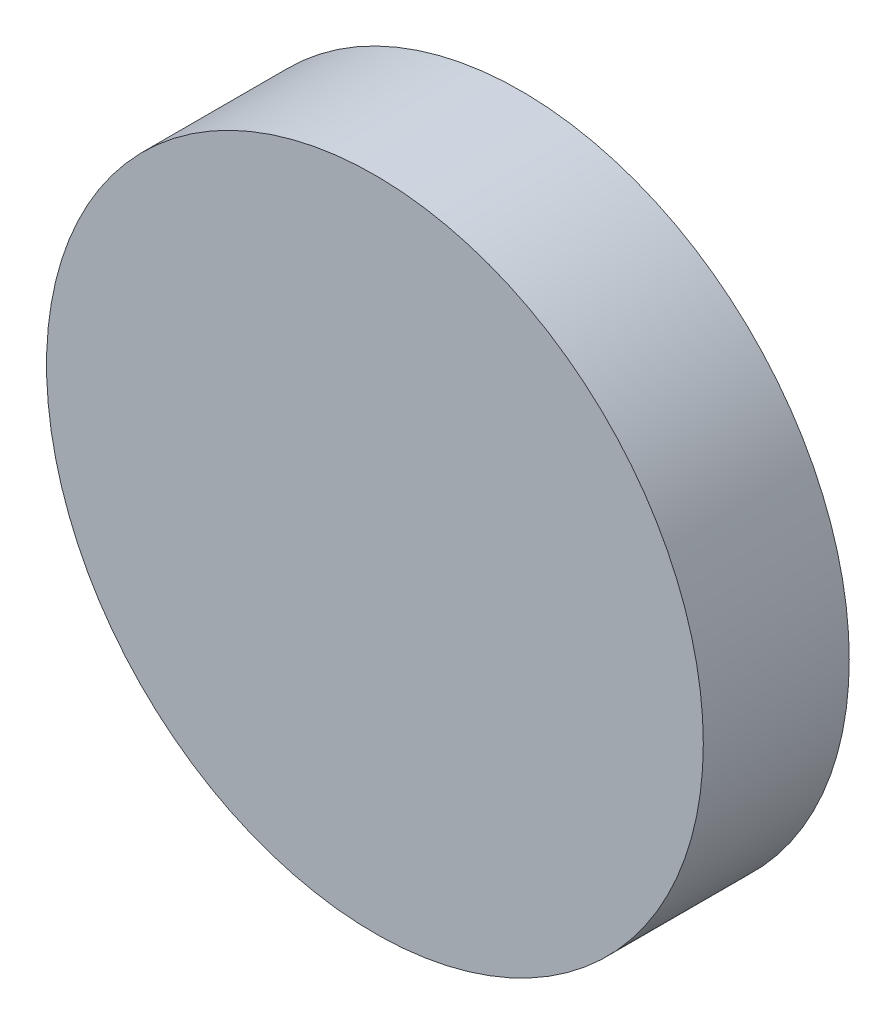
ISO-10303-21;
HEADER;
FILE_DESCRIPTION(('STEP AP214'),'2;1');
FILE_NAME('part.step','',(''),(''),'','','');
FILE_SCHEMA(('AUTOMOTIVE_DESIGN { 1 0 10303 214 1 1 1 1 }'));
ENDSEC;
DATA;
#1=APPLICATION_CONTEXT('core data for automotive mechanical design processes');
#2=APPLICATION_PROTOCOL_DEFINITION('international standard','automotive_design',2000,#1);
#3=PRODUCT_CONTEXT('',#1,'mechanical');
#4=PRODUCT('Part','Part','',(#3));
#5=PRODUCT_RELATED_PRODUCT_CATEGORY('part','',(#4));
#6=PRODUCT_DEFINITION_FORMATION('','',#4);
#7=PRODUCT_DEFINITION_CONTEXT('part definition',#1,'design');
#8=PRODUCT_DEFINITION('design','',#6,#7);
#9=PRODUCT_DEFINITION_SHAPE('','',#8);
#10=(LENGTH_UNIT() NAMED_UNIT(*) SI_UNIT(.MILLI.,.METRE.));
#11=(NAMED_UNIT(*) PLANE_ANGLE_UNIT() SI_UNIT($,.RADIAN.));
#12=(NAMED_UNIT(*) SI_UNIT($,.STERADIAN.) SOLID_ANGLE_UNIT());
#13=UNCERTAINTY_MEASURE_WITH_UNIT(LENGTH_MEASURE(1.E-05),#10,'distance_accuracy_value','');
#14=(GEOMETRIC_REPRESENTATION_CONTEXT(3) GLOBAL_UNCERTAINTY_ASSIGNED_CONTEXT((#13)) GLOBAL_UNIT_ASSIGNED_CONTEXT((#10,
#11,#12)) REPRESENTATION_CONTEXT('',''));
#15=CARTESIAN_POINT('',(0.,0.,0.));
#16=DIRECTION('',(0.,0.,1.));
#17=DIRECTION('',(1.,0.,0.));
#18=AXIS2_PLACEMENT_3D('',#15,#16,#17);
#19=CARTESIAN_POINT('',(700.,1450.,-790.));
#20=DIRECTION('',(0.,0.,1.));
#21=DIRECTION('',(1.,0.,0.));
#22=AXIS2_PLACEMENT_3D('',#19,#20,#21);
#23=CYLINDRICAL_SURFACE('',#22,90.);
#24=CARTESIAN_POINT('',(700.,1450.,-790.));
#25=DIRECTION('',(0.,0.,1.));
#26=DIRECTION('',(1.,0.,0.));
#27=AXIS2_PLACEMENT_3D('',#24,#25,#26);
#28=CIRCLE('',#27,90.);
#29=CARTESIAN_POINT('',(790.,1450.,-790.));
#30=VERTEX_POINT('',#29);
#31=EDGE_CURVE('E10',#30,#30,#28,.T.);
#32=ORIENTED_EDGE('',*,*,#31,.T.);
#33=EDGE_LOOP('',(#32));
#34=FACE_BOUND('',#33,.T.);
#35=CARTESIAN_POINT('',(700.,1450.,-750.));
#36=DIRECTION('',(0.,0.,1.));
#37=DIRECTION('',(1.,0.,0.));
#38=AXIS2_PLACEMENT_3D('',#35,#36,#37);
#39=CIRCLE('',#38,90.);
#40=CARTESIAN_POINT('',(790.,1450.,-750.));
#41=VERTEX_POINT('',#40);
#42=EDGE_CURVE('E40',#41,#41,#39,.T.);
#43=ORIENTED_EDGE('',*,*,#42,.F.);
#44=EDGE_LOOP('',(#43));
#45=FACE_BOUND('',#44,.T.);
#46=ADVANCED_FACE('F37',(#34,#45),#23,.T.);
#47=CARTESIAN_POINT('',(700.,1450.,-790.));
#48=DIRECTION('',(0.,0.,1.));
#49=DIRECTION('',(1.,0.,0.));
#50=AXIS2_PLACEMENT_3D('',#47,#48,#49);
#51=PLANE('',#50);
#52=ORIENTED_EDGE('',*,*,#31,.F.);
#53=EDGE_LOOP('',(#52));
#54=FACE_BOUND('',#53,.T.);
#55=ADVANCED_FACE('F52',(#54),#51,.F.);
#56=CARTESIAN_POINT('',(700.,1450.,-750.));
#57=DIRECTION('',(0.,0.,1.));
#58=DIRECTION('',(1.,0.,0.));
#59=AXIS2_PLACEMENT_3D('',#56,#57,#58);
#60=PLANE('',#59);
#61=ORIENTED_EDGE('',*,*,#42,.T.);
#62=EDGE_LOOP('',(#61));
#63=FACE_BOUND('',#62,.T.);
#64=ADVANCED_FACE('F49',(#63),#60,.T.);
#65=CLOSED_SHELL('',(#46,#55,#64));
#66=MANIFOLD_SOLID_BREP('B2',#65);
#67=ADVANCED_BREP_SHAPE_REPRESENTATION('',(#18,#66),#14);
#68=SHAPE_DEFINITION_REPRESENTATION(#9,#67);
ENDSEC;
END-ISO-10303-21;
